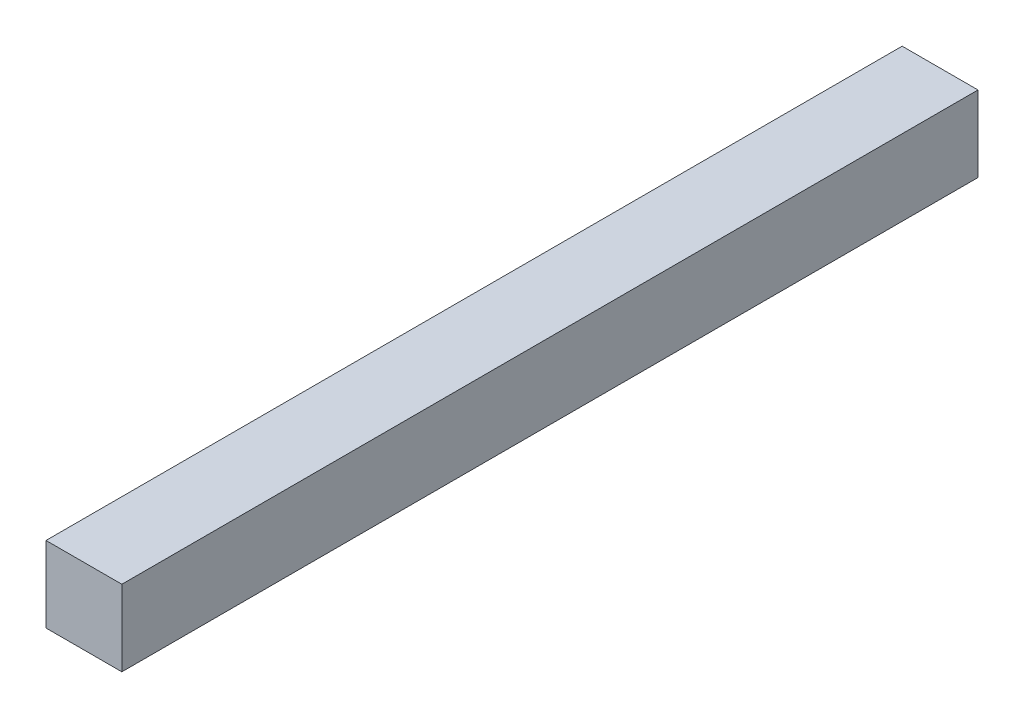
ISO-10303-21;
HEADER;
FILE_DESCRIPTION(('STEP AP214'),'2;1');
FILE_NAME('part.step','',(''),(''),'','','');
FILE_SCHEMA(('AUTOMOTIVE_DESIGN { 1 0 10303 214 1 1 1 1 }'));
ENDSEC;
DATA;
#1=APPLICATION_CONTEXT('core data for automotive mechanical design processes');
#2=APPLICATION_PROTOCOL_DEFINITION('international standard','automotive_design',2000,#1);
#3=PRODUCT_CONTEXT('',#1,'mechanical');
#4=PRODUCT('Part','Part','',(#3));
#5=PRODUCT_RELATED_PRODUCT_CATEGORY('part','',(#4));
#6=PRODUCT_DEFINITION_FORMATION('','',#4);
#7=PRODUCT_DEFINITION_CONTEXT('part definition',#1,'design');
#8=PRODUCT_DEFINITION('design','',#6,#7);
#9=PRODUCT_DEFINITION_SHAPE('','',#8);
#10=(LENGTH_UNIT() NAMED_UNIT(*) SI_UNIT(.MILLI.,.METRE.));
#11=(NAMED_UNIT(*) PLANE_ANGLE_UNIT() SI_UNIT($,.RADIAN.));
#12=(NAMED_UNIT(*) SI_UNIT($,.STERADIAN.) SOLID_ANGLE_UNIT());
#13=UNCERTAINTY_MEASURE_WITH_UNIT(LENGTH_MEASURE(1.E-05),#10,'distance_accuracy_value','');
#14=(GEOMETRIC_REPRESENTATION_CONTEXT(3) GLOBAL_UNCERTAINTY_ASSIGNED_CONTEXT((#13)) GLOBAL_UNIT_ASSIGNED_CONTEXT((#10,
#11,#12)) REPRESENTATION_CONTEXT('',''));
#15=CARTESIAN_POINT('',(0.,0.,0.));
#16=DIRECTION('',(0.,0.,1.));
#17=DIRECTION('',(1.,0.,0.));
#18=AXIS2_PLACEMENT_3D('',#15,#16,#17);
#19=CARTESIAN_POINT('',(-0.381,-0.381,0.));
#20=DIRECTION('',(-1.,0.,0.));
#21=DIRECTION('',(0.,0.,1.));
#22=AXIS2_PLACEMENT_3D('',#19,#20,#21);
#23=PLANE('',#22);
#24=DIRECTION('',(0.,0.,1.));
#25=VECTOR('',#24,1.);
#26=CARTESIAN_POINT('',(-0.381,0.381,0.));
#27=LINE('',#26,#25);
#28=CARTESIAN_POINT('',(-0.381,0.381,0.));
#29=VERTEX_POINT('',#28);
#30=CARTESIAN_POINT('',(-0.381,0.381,8.60000058));
#31=VERTEX_POINT('',#30);
#32=EDGE_CURVE('E62',#29,#31,#27,.T.);
#33=ORIENTED_EDGE('',*,*,#32,.F.);
#34=DIRECTION('',(0.,1.,0.));
#35=VECTOR('',#34,1.);
#36=CARTESIAN_POINT('',(-0.381,-0.381,0.));
#37=LINE('',#36,#35);
#38=CARTESIAN_POINT('',(-0.381,-0.381,0.));
#39=VERTEX_POINT('',#38);
#40=EDGE_CURVE('E20',#29,#39,#37,.F.);
#41=ORIENTED_EDGE('',*,*,#40,.T.);
#42=DIRECTION('',(0.,0.,-1.));
#43=VECTOR('',#42,1.);
#44=CARTESIAN_POINT('',(-0.381,-0.381,0.));
#45=LINE('',#44,#43);
#46=CARTESIAN_POINT('',(-0.381,-0.381,8.60000058));
#47=VERTEX_POINT('',#46);
#48=EDGE_CURVE('E69',#47,#39,#45,.T.);
#49=ORIENTED_EDGE('',*,*,#48,.F.);
#50=DIRECTION('',(0.,1.,0.));
#51=VECTOR('',#50,1.);
#52=CARTESIAN_POINT('',(-0.381,0.381,8.60000058));
#53=LINE('',#52,#51);
#54=EDGE_CURVE('E56',#31,#47,#53,.F.);
#55=ORIENTED_EDGE('',*,*,#54,.F.);
#56=EDGE_LOOP('',(#33,#41,#49,#55));
#57=FACE_BOUND('',#56,.T.);
#58=ADVANCED_FACE('F17',(#57),#23,.T.);
#59=CARTESIAN_POINT('',(-0.381,0.381,0.));
#60=DIRECTION('',(0.,1.,0.));
#61=DIRECTION('',(0.,0.,1.));
#62=AXIS2_PLACEMENT_3D('',#59,#60,#61);
#63=PLANE('',#62);
#64=DIRECTION('',(0.,0.,-1.));
#65=VECTOR('',#64,1.);
#66=CARTESIAN_POINT('',(0.381,0.381,0.));
#67=LINE('',#66,#65);
#68=CARTESIAN_POINT('',(0.381,0.381,0.));
#69=VERTEX_POINT('',#68);
#70=CARTESIAN_POINT('',(0.381,0.381,8.60000058));
#71=VERTEX_POINT('',#70);
#72=EDGE_CURVE('E83',#69,#71,#67,.F.);
#73=ORIENTED_EDGE('',*,*,#72,.F.);
#74=DIRECTION('',(1.,0.,0.));
#75=VECTOR('',#74,1.);
#76=CARTESIAN_POINT('',(0.381,0.381,0.));
#77=LINE('',#76,#75);
#78=EDGE_CURVE('E67',#69,#29,#77,.F.);
#79=ORIENTED_EDGE('',*,*,#78,.T.);
#80=ORIENTED_EDGE('',*,*,#32,.T.);
#81=DIRECTION('',(1.,0.,0.));
#82=VECTOR('',#81,1.);
#83=CARTESIAN_POINT('',(0.381,0.381,8.60000058));
#84=LINE('',#83,#82);
#85=EDGE_CURVE('E64',#71,#31,#84,.F.);
#86=ORIENTED_EDGE('',*,*,#85,.F.);
#87=EDGE_LOOP('',(#73,#79,#80,#86));
#88=FACE_BOUND('',#87,.T.);
#89=ADVANCED_FACE('F63',(#88),#63,.T.);
#90=CARTESIAN_POINT('',(0.381,0.381,8.60000058));
#91=DIRECTION('',(0.,0.,1.));
#92=DIRECTION('',(1.,0.,0.));
#93=AXIS2_PLACEMENT_3D('',#90,#91,#92);
#94=PLANE('',#93);
#95=DIRECTION('',(1.,0.,0.));
#96=VECTOR('',#95,1.);
#97=CARTESIAN_POINT('',(0.381,-0.381,8.60000058));
#98=LINE('',#97,#96);
#99=CARTESIAN_POINT('',(0.381,-0.381,8.60000058));
#100=VERTEX_POINT('',#99);
#101=EDGE_CURVE('E71',#100,#47,#98,.F.);
#102=ORIENTED_EDGE('',*,*,#101,.F.);
#103=DIRECTION('',(0.,1.,0.));
#104=VECTOR('',#103,1.);
#105=CARTESIAN_POINT('',(0.381,0.381,8.60000058));
#106=LINE('',#105,#104);
#107=EDGE_CURVE('E75',#71,#100,#106,.F.);
#108=ORIENTED_EDGE('',*,*,#107,.F.);
#109=ORIENTED_EDGE('',*,*,#85,.T.);
#110=ORIENTED_EDGE('',*,*,#54,.T.);
#111=EDGE_LOOP('',(#102,#108,#109,#110));
#112=FACE_BOUND('',#111,.T.);
#113=ADVANCED_FACE('F73',(#112),#94,.T.);
#114=CARTESIAN_POINT('',(0.381,-0.381,0.));
#115=DIRECTION('',(0.,-1.,0.));
#116=DIRECTION('',(0.,0.,-1.));
#117=AXIS2_PLACEMENT_3D('',#114,#115,#116);
#118=PLANE('',#117);
#119=ORIENTED_EDGE('',*,*,#48,.T.);
#120=DIRECTION('',(1.,0.,0.));
#121=VECTOR('',#120,1.);
#122=CARTESIAN_POINT('',(0.381,-0.381,0.));
#123=LINE('',#122,#121);
#124=CARTESIAN_POINT('',(0.381,-0.381,0.));
#125=VERTEX_POINT('',#124);
#126=EDGE_CURVE('E35',#39,#125,#123,.T.);
#127=ORIENTED_EDGE('',*,*,#126,.T.);
#128=DIRECTION('',(0.,0.,-1.));
#129=VECTOR('',#128,1.);
#130=CARTESIAN_POINT('',(0.381,-0.381,0.));
#131=LINE('',#130,#129);
#132=EDGE_CURVE('E26',#100,#125,#131,.T.);
#133=ORIENTED_EDGE('',*,*,#132,.F.);
#134=ORIENTED_EDGE('',*,*,#101,.T.);
#135=EDGE_LOOP('',(#119,#127,#133,#134));
#136=FACE_BOUND('',#135,.T.);
#137=ADVANCED_FACE('F89',(#136),#118,.T.);
#138=CARTESIAN_POINT('',(0.381,0.381,0.));
#139=DIRECTION('',(0.,0.,1.));
#140=DIRECTION('',(1.,0.,0.));
#141=AXIS2_PLACEMENT_3D('',#138,#139,#140);
#142=PLANE('',#141);
#143=ORIENTED_EDGE('',*,*,#126,.F.);
#144=ORIENTED_EDGE('',*,*,#40,.F.);
#145=ORIENTED_EDGE('',*,*,#78,.F.);
#146=DIRECTION('',(0.,1.,0.));
#147=VECTOR('',#146,1.);
#148=CARTESIAN_POINT('',(0.381,0.381,0.));
#149=LINE('',#148,#147);
#150=EDGE_CURVE('E11',#125,#69,#149,.T.);
#151=ORIENTED_EDGE('',*,*,#150,.F.);
#152=EDGE_LOOP('',(#143,#144,#145,#151));
#153=FACE_BOUND('',#152,.T.);
#154=ADVANCED_FACE('F91',(#153),#142,.F.);
#155=CARTESIAN_POINT('',(0.381,0.381,0.));
#156=DIRECTION('',(1.,0.,0.));
#157=DIRECTION('',(0.,0.,-1.));
#158=AXIS2_PLACEMENT_3D('',#155,#156,#157);
#159=PLANE('',#158);
#160=ORIENTED_EDGE('',*,*,#132,.T.);
#161=ORIENTED_EDGE('',*,*,#150,.T.);
#162=ORIENTED_EDGE('',*,*,#72,.T.);
#163=ORIENTED_EDGE('',*,*,#107,.T.);
#164=EDGE_LOOP('',(#160,#161,#162,#163));
#165=FACE_BOUND('',#164,.T.);
#166=ADVANCED_FACE('F88',(#165),#159,.T.);
#167=CLOSED_SHELL('',(#58,#89,#113,#137,#154,#166));
#168=MANIFOLD_SOLID_BREP('B1',#167);
#169=ADVANCED_BREP_SHAPE_REPRESENTATION('',(#18,#168),#14);
#170=SHAPE_DEFINITION_REPRESENTATION(#9,#169);
ENDSEC;
END-ISO-10303-21;
